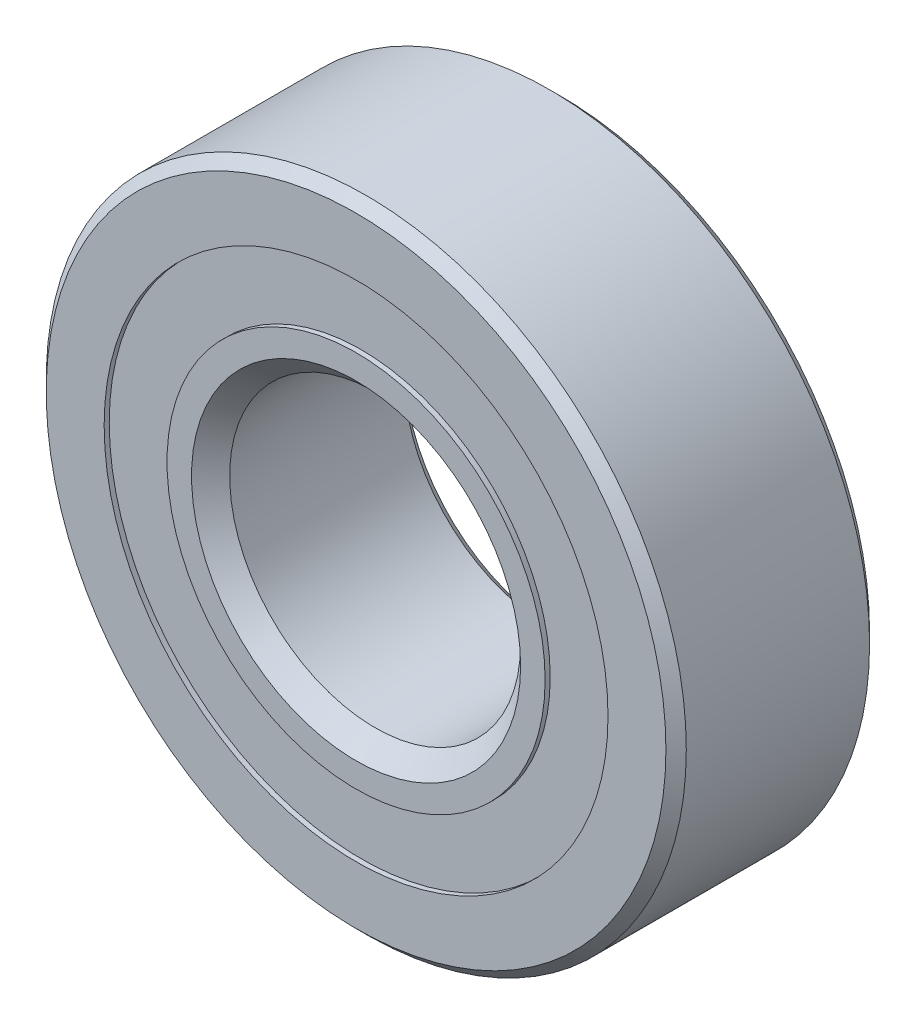
ISO-10303-21;
HEADER;
FILE_DESCRIPTION(('STEP AP214'),'2;1');
FILE_NAME('part.step','',(''),(''),'','','');
FILE_SCHEMA(('AUTOMOTIVE_DESIGN { 1 0 10303 214 1 1 1 1 }'));
ENDSEC;
DATA;
#1=APPLICATION_CONTEXT('core data for automotive mechanical design processes');
#2=APPLICATION_PROTOCOL_DEFINITION('international standard','automotive_design',2000,#1);
#3=PRODUCT_CONTEXT('',#1,'mechanical');
#4=PRODUCT('Part','Part','',(#3));
#5=PRODUCT_RELATED_PRODUCT_CATEGORY('part','',(#4));
#6=PRODUCT_DEFINITION_FORMATION('','',#4);
#7=PRODUCT_DEFINITION_CONTEXT('part definition',#1,'design');
#8=PRODUCT_DEFINITION('design','',#6,#7);
#9=PRODUCT_DEFINITION_SHAPE('','',#8);
#10=(LENGTH_UNIT() NAMED_UNIT(*) SI_UNIT(.MILLI.,.METRE.));
#11=(NAMED_UNIT(*) PLANE_ANGLE_UNIT() SI_UNIT($,.RADIAN.));
#12=(NAMED_UNIT(*) SI_UNIT($,.STERADIAN.) SOLID_ANGLE_UNIT());
#13=UNCERTAINTY_MEASURE_WITH_UNIT(LENGTH_MEASURE(1.E-05),#10,'distance_accuracy_value','');
#14=(GEOMETRIC_REPRESENTATION_CONTEXT(3) GLOBAL_UNCERTAINTY_ASSIGNED_CONTEXT((#13)) GLOBAL_UNIT_ASSIGNED_CONTEXT((#10,
#11,#12)) REPRESENTATION_CONTEXT('',''));
#15=CARTESIAN_POINT('',(0.,0.,0.));
#16=DIRECTION('',(0.,0.,1.));
#17=DIRECTION('',(1.,0.,0.));
#18=AXIS2_PLACEMENT_3D('',#15,#16,#17);
#19=CARTESIAN_POINT('',(0.,13.7467032967033,-5.2784375));
#20=DIRECTION('',(0.,0.,1.));
#21=DIRECTION('',(1.,0.,0.));
#22=AXIS2_PLACEMENT_3D('',#19,#20,#21);
#23=PLANE('',#22);
#24=CARTESIAN_POINT('',(0.,0.,-5.2784375));
#25=DIRECTION('',(0.,0.,1.));
#26=DIRECTION('',(1.,0.,0.));
#27=AXIS2_PLACEMENT_3D('',#24,#25,#26);
#28=CIRCLE('',#27,13.7467032967033);
#29=CARTESIAN_POINT('',(13.7467032967033,0.,-5.2784375));
#30=VERTEX_POINT('',#29);
#31=EDGE_CURVE('E58',#30,#30,#28,.T.);
#32=ORIENTED_EDGE('',*,*,#31,.F.);
#33=EDGE_LOOP('',(#32));
#34=FACE_BOUND('',#33,.T.);
#35=CARTESIAN_POINT('',(0.,0.,-5.2784375));
#36=DIRECTION('',(0.,0.,1.));
#37=DIRECTION('',(1.,0.,0.));
#38=AXIS2_PLACEMENT_3D('',#35,#36,#37);
#39=CIRCLE('',#38,10.3154944719791);
#40=CARTESIAN_POINT('',(10.3154944719791,0.,-5.2784375));
#41=VERTEX_POINT('',#40);
#42=EDGE_CURVE('E11',#41,#41,#39,.T.);
#43=ORIENTED_EDGE('',*,*,#42,.T.);
#44=EDGE_LOOP('',(#43));
#45=FACE_BOUND('',#44,.T.);
#46=ADVANCED_FACE('F44',(#34,#45),#23,.F.);
#47=CARTESIAN_POINT('',(0.,0.,5.55625));
#48=DIRECTION('',(0.,0.,1.));
#49=DIRECTION('',(1.,0.,0.));
#50=AXIS2_PLACEMENT_3D('',#47,#48,#49);
#51=CYLINDRICAL_SURFACE('',#50,10.3154944719791);
#52=ORIENTED_EDGE('',*,*,#42,.F.);
#53=EDGE_LOOP('',(#52));
#54=FACE_BOUND('',#53,.T.);
#55=CARTESIAN_POINT('',(0.,0.,-2.68211551867683));
#56=DIRECTION('',(0.,0.,1.));
#57=DIRECTION('',(1.,0.,0.));
#58=AXIS2_PLACEMENT_3D('',#55,#56,#57);
#59=CIRCLE('',#58,10.3154944719791);
#60=CARTESIAN_POINT('',(10.3154944719791,0.,-2.68211551867683));
#61=VERTEX_POINT('',#60);
#62=EDGE_CURVE('E50',#61,#61,#59,.T.);
#63=ORIENTED_EDGE('',*,*,#62,.T.);
#64=EDGE_LOOP('',(#63));
#65=FACE_BOUND('',#64,.T.);
#66=ADVANCED_FACE('F67',(#54,#65),#51,.F.);
#67=CARTESIAN_POINT('',(0.,13.7467032967033,-2.68211551867683));
#68=DIRECTION('',(0.,0.,-1.));
#69=DIRECTION('',(-1.,0.,0.));
#70=AXIS2_PLACEMENT_3D('',#67,#68,#69);
#71=PLANE('',#70);
#72=ORIENTED_EDGE('',*,*,#62,.F.);
#73=EDGE_LOOP('',(#72));
#74=FACE_BOUND('',#73,.T.);
#75=CARTESIAN_POINT('',(0.,0.,-2.68211551867683));
#76=DIRECTION('',(0.,0.,1.));
#77=DIRECTION('',(1.,0.,0.));
#78=AXIS2_PLACEMENT_3D('',#75,#76,#77);
#79=CIRCLE('',#78,13.7467032967033);
#80=CARTESIAN_POINT('',(13.7467032967033,0.,-2.68211551867683));
#81=VERTEX_POINT('',#80);
#82=EDGE_CURVE('E54',#81,#81,#79,.T.);
#83=ORIENTED_EDGE('',*,*,#82,.T.);
#84=EDGE_LOOP('',(#83));
#85=FACE_BOUND('',#84,.T.);
#86=ADVANCED_FACE('F71',(#74,#85),#71,.F.);
#87=CARTESIAN_POINT('',(0.,0.,5.55625));
#88=DIRECTION('',(0.,0.,1.));
#89=DIRECTION('',(1.,0.,0.));
#90=AXIS2_PLACEMENT_3D('',#87,#88,#89);
#91=CYLINDRICAL_SURFACE('',#90,13.7467032967033);
#92=ORIENTED_EDGE('',*,*,#82,.F.);
#93=EDGE_LOOP('',(#92));
#94=FACE_BOUND('',#93,.T.);
#95=ORIENTED_EDGE('',*,*,#31,.T.);
#96=EDGE_LOOP('',(#95));
#97=FACE_BOUND('',#96,.T.);
#98=ADVANCED_FACE('F64',(#94,#97),#91,.T.);
#99=CLOSED_SHELL('',(#46,#66,#86,#98));
#100=MANIFOLD_SOLID_BREP('B2',#99);
#101=CARTESIAN_POINT('',(0.,13.7467032967033,5.2784375));
#102=DIRECTION('',(0.,0.,-1.));
#103=DIRECTION('',(-1.,0.,0.));
#104=AXIS2_PLACEMENT_3D('',#101,#102,#103);
#105=PLANE('',#104);
#106=CARTESIAN_POINT('',(0.,0.,5.2784375));
#107=DIRECTION('',(0.,0.,1.));
#108=DIRECTION('',(1.,0.,0.));
#109=AXIS2_PLACEMENT_3D('',#106,#107,#108);
#110=CIRCLE('',#109,10.3154944719791);
#111=CARTESIAN_POINT('',(10.3154944719791,0.,5.2784375));
#112=VERTEX_POINT('',#111);
#113=EDGE_CURVE('E43',#112,#112,#110,.T.);
#114=ORIENTED_EDGE('',*,*,#113,.F.);
#115=EDGE_LOOP('',(#114));
#116=FACE_BOUND('',#115,.T.);
#117=CARTESIAN_POINT('',(0.,0.,5.2784375));
#118=DIRECTION('',(0.,0.,1.));
#119=DIRECTION('',(1.,0.,0.));
#120=AXIS2_PLACEMENT_3D('',#117,#118,#119);
#121=CIRCLE('',#120,13.7467032967033);
#122=CARTESIAN_POINT('',(13.7467032967033,0.,5.2784375));
#123=VERTEX_POINT('',#122);
#124=EDGE_CURVE('E126',#123,#123,#121,.T.);
#125=ORIENTED_EDGE('',*,*,#124,.T.);
#126=EDGE_LOOP('',(#125));
#127=FACE_BOUND('',#126,.T.);
#128=ADVANCED_FACE('F112',(#116,#127),#105,.F.);
#129=CARTESIAN_POINT('',(0.,0.,5.55625));
#130=DIRECTION('',(0.,0.,1.));
#131=DIRECTION('',(1.,0.,0.));
#132=AXIS2_PLACEMENT_3D('',#129,#130,#131);
#133=CYLINDRICAL_SURFACE('',#132,10.3154944719791);
#134=CARTESIAN_POINT('',(0.,0.,2.68211551867683));
#135=DIRECTION('',(0.,0.,1.));
#136=DIRECTION('',(1.,0.,0.));
#137=AXIS2_PLACEMENT_3D('',#134,#135,#136);
#138=CIRCLE('',#137,10.3154944719791);
#139=CARTESIAN_POINT('',(10.3154944719791,0.,2.68211551867683));
#140=VERTEX_POINT('',#139);
#141=EDGE_CURVE('E118',#140,#140,#138,.T.);
#142=ORIENTED_EDGE('',*,*,#141,.F.);
#143=EDGE_LOOP('',(#142));
#144=FACE_BOUND('',#143,.T.);
#145=ORIENTED_EDGE('',*,*,#113,.T.);
#146=EDGE_LOOP('',(#145));
#147=FACE_BOUND('',#146,.T.);
#148=ADVANCED_FACE('F141',(#144,#147),#133,.F.);
#149=CARTESIAN_POINT('',(0.,13.7467032967033,2.68211551867683));
#150=DIRECTION('',(0.,0.,1.));
#151=DIRECTION('',(1.,0.,0.));
#152=AXIS2_PLACEMENT_3D('',#149,#150,#151);
#153=PLANE('',#152);
#154=CARTESIAN_POINT('',(0.,0.,2.68211551867683));
#155=DIRECTION('',(0.,0.,1.));
#156=DIRECTION('',(1.,0.,0.));
#157=AXIS2_PLACEMENT_3D('',#154,#155,#156);
#158=CIRCLE('',#157,13.7467032967033);
#159=CARTESIAN_POINT('',(13.7467032967033,0.,2.68211551867683));
#160=VERTEX_POINT('',#159);
#161=EDGE_CURVE('E122',#160,#160,#158,.T.);
#162=ORIENTED_EDGE('',*,*,#161,.F.);
#163=EDGE_LOOP('',(#162));
#164=FACE_BOUND('',#163,.T.);
#165=ORIENTED_EDGE('',*,*,#141,.T.);
#166=EDGE_LOOP('',(#165));
#167=FACE_BOUND('',#166,.T.);
#168=ADVANCED_FACE('F136',(#164,#167),#153,.F.);
#169=CARTESIAN_POINT('',(0.,0.,5.55625));
#170=DIRECTION('',(0.,0.,1.));
#171=DIRECTION('',(1.,0.,0.));
#172=AXIS2_PLACEMENT_3D('',#169,#170,#171);
#173=CYLINDRICAL_SURFACE('',#172,13.7467032967033);
#174=ORIENTED_EDGE('',*,*,#124,.F.);
#175=EDGE_LOOP('',(#174));
#176=FACE_BOUND('',#175,.T.);
#177=ORIENTED_EDGE('',*,*,#161,.T.);
#178=EDGE_LOOP('',(#177));
#179=FACE_BOUND('',#178,.T.);
#180=ADVANCED_FACE('F133',(#176,#179),#173,.T.);
#181=CLOSED_SHELL('',(#128,#148,#168,#180));
#182=MANIFOLD_SOLID_BREP('B6',#181);
#183=CARTESIAN_POINT('',(-6.34999999999986,10.9985226280625,0.));
#184=DIRECTION('',(0.,0.,1.));
#185=DIRECTION('',(-0.499999999999989,0.866025403784445,0.));
#186=AXIS2_PLACEMENT_3D('',#183,#184,#185);
#187=SPHERICAL_SURFACE('',#186,2.68211551867683);
#188=CARTESIAN_POINT('',(-6.34999999999986,10.9985226280625,2.68211551867683));
#189=VERTEX_POINT('',#188);
#190=VERTEX_LOOP('',#189);
#191=FACE_BOUND('',#190,.T.);
#192=ADVANCED_FACE('F194',(#191),#187,.T.);
#193=CLOSED_SHELL('',(#192));
#194=MANIFOLD_SOLID_BREP('B38',#193);
#195=CARTESIAN_POINT('',(-10.9985226280623,6.35000000000013,0.));
#196=DIRECTION('',(0.,0.,1.));
#197=DIRECTION('',(-0.866025403784433,0.50000000000001,0.));
#198=AXIS2_PLACEMENT_3D('',#195,#196,#197);
#199=SPHERICAL_SURFACE('',#198,2.68211551867683);
#200=CARTESIAN_POINT('',(-10.9985226280623,6.35000000000013,2.68211551867683));
#201=VERTEX_POINT('',#200);
#202=VERTEX_LOOP('',#201);
#203=FACE_BOUND('',#202,.T.);
#204=ADVANCED_FACE('F227',(#203),#199,.T.);
#205=CLOSED_SHELL('',(#204));
#206=MANIFOLD_SOLID_BREP('B108',#205);
#207=CARTESIAN_POINT('',(-12.7,1.33025439009923E-13,0.));
#208=DIRECTION('',(0.,0.,1.));
#209=DIRECTION('',(-1.,0.,0.));
#210=AXIS2_PLACEMENT_3D('',#207,#208,#209);
#211=SPHERICAL_SURFACE('',#210,2.68211551867683);
#212=CARTESIAN_POINT('',(-12.7,1.33025439009923E-13,2.68211551867683));
#213=VERTEX_POINT('',#212);
#214=VERTEX_LOOP('',#213);
#215=FACE_BOUND('',#214,.T.);
#216=ADVANCED_FACE('F260',(#215),#211,.T.);
#217=CLOSED_SHELL('',(#216));
#218=MANIFOLD_SOLID_BREP('B190',#217);
#219=CARTESIAN_POINT('',(-10.9985226280624,-6.3499999999999,0.));
#220=DIRECTION('',(0.,0.,1.));
#221=DIRECTION('',(-0.866025403784443,-0.499999999999992,0.));
#222=AXIS2_PLACEMENT_3D('',#219,#220,#221);
#223=SPHERICAL_SURFACE('',#222,2.68211551867683);
#224=CARTESIAN_POINT('',(-10.9985226280624,-6.3499999999999,2.68211551867683));
#225=VERTEX_POINT('',#224);
#226=VERTEX_LOOP('',#225);
#227=FACE_BOUND('',#226,.T.);
#228=ADVANCED_FACE('F293',(#227),#223,.T.);
#229=CLOSED_SHELL('',(#228));
#230=MANIFOLD_SOLID_BREP('B223',#229);
#231=CARTESIAN_POINT('',(-6.35000000000009,-10.9985226280623,0.));
#232=DIRECTION('',(0.,0.,1.));
#233=DIRECTION('',(-0.500000000000007,-0.866025403784435,0.));
#234=AXIS2_PLACEMENT_3D('',#231,#232,#233);
#235=SPHERICAL_SURFACE('',#234,2.68211551867683);
#236=CARTESIAN_POINT('',(-6.35000000000009,-10.9985226280623,2.68211551867683));
#237=VERTEX_POINT('',#236);
#238=VERTEX_LOOP('',#237);
#239=FACE_BOUND('',#238,.T.);
#240=ADVANCED_FACE('F326',(#239),#235,.T.);
#241=CLOSED_SHELL('',(#240));
#242=MANIFOLD_SOLID_BREP('B256',#241);
#243=CARTESIAN_POINT('',(0.,-12.7,0.));
#244=DIRECTION('',(0.,0.,1.));
#245=DIRECTION('',(0.,-1.,0.));
#246=AXIS2_PLACEMENT_3D('',#243,#244,#245);
#247=SPHERICAL_SURFACE('',#246,2.68211551867683);
#248=CARTESIAN_POINT('',(0.,-12.7,2.68211551867683));
#249=VERTEX_POINT('',#248);
#250=VERTEX_LOOP('',#249);
#251=FACE_BOUND('',#250,.T.);
#252=ADVANCED_FACE('F359',(#251),#247,.T.);
#253=CLOSED_SHELL('',(#252));
#254=MANIFOLD_SOLID_BREP('B289',#253);
#255=CARTESIAN_POINT('',(6.34999999999994,-10.9985226280624,0.));
#256=DIRECTION('',(0.,0.,1.));
#257=DIRECTION('',(0.499999999999995,-0.866025403784442,0.));
#258=AXIS2_PLACEMENT_3D('',#255,#256,#257);
#259=SPHERICAL_SURFACE('',#258,2.68211551867683);
#260=CARTESIAN_POINT('',(6.34999999999994,-10.9985226280624,2.68211551867683));
#261=VERTEX_POINT('',#260);
#262=VERTEX_LOOP('',#261);
#263=FACE_BOUND('',#262,.T.);
#264=ADVANCED_FACE('F392',(#263),#259,.T.);
#265=CLOSED_SHELL('',(#264));
#266=MANIFOLD_SOLID_BREP('B322',#265);
#267=CARTESIAN_POINT('',(10.9985226280623,-6.35000000000005,0.));
#268=DIRECTION('',(0.,0.,1.));
#269=DIRECTION('',(0.866025403784436,-0.500000000000004,0.));
#270=AXIS2_PLACEMENT_3D('',#267,#268,#269);
#271=SPHERICAL_SURFACE('',#270,2.68211551867683);
#272=CARTESIAN_POINT('',(10.9985226280623,-6.35000000000005,2.68211551867683));
#273=VERTEX_POINT('',#272);
#274=VERTEX_LOOP('',#273);
#275=FACE_BOUND('',#274,.T.);
#276=ADVANCED_FACE('F425',(#275),#271,.T.);
#277=CLOSED_SHELL('',(#276));
#278=MANIFOLD_SOLID_BREP('B355',#277);
#279=CARTESIAN_POINT('',(12.7,0.,0.));
#280=DIRECTION('',(0.,0.,1.));
#281=DIRECTION('',(1.,0.,0.));
#282=AXIS2_PLACEMENT_3D('',#279,#280,#281);
#283=SPHERICAL_SURFACE('',#282,2.68211551867683);
#284=CARTESIAN_POINT('',(12.7,0.,2.68211551867683));
#285=VERTEX_POINT('',#284);
#286=VERTEX_LOOP('',#285);
#287=FACE_BOUND('',#286,.T.);
#288=ADVANCED_FACE('F458',(#287),#283,.T.);
#289=CLOSED_SHELL('',(#288));
#290=MANIFOLD_SOLID_BREP('B388',#289);
#291=CARTESIAN_POINT('',(10.9985226280624,6.34999999999997,0.));
#292=DIRECTION('',(0.,0.,1.));
#293=DIRECTION('',(0.86602540378444,0.499999999999998,0.));
#294=AXIS2_PLACEMENT_3D('',#291,#292,#293);
#295=SPHERICAL_SURFACE('',#294,2.68211551867683);
#296=CARTESIAN_POINT('',(10.9985226280624,6.34999999999997,2.68211551867683));
#297=VERTEX_POINT('',#296);
#298=VERTEX_LOOP('',#297);
#299=FACE_BOUND('',#298,.T.);
#300=ADVANCED_FACE('F491',(#299),#295,.T.);
#301=CLOSED_SHELL('',(#300));
#302=MANIFOLD_SOLID_BREP('B421',#301);
#303=CARTESIAN_POINT('',(6.35000000000001,10.9985226280624,0.));
#304=DIRECTION('',(0.,0.,1.));
#305=DIRECTION('',(0.500000000000001,0.866025403784438,0.));
#306=AXIS2_PLACEMENT_3D('',#303,#304,#305);
#307=SPHERICAL_SURFACE('',#306,2.68211551867683);
#308=CARTESIAN_POINT('',(6.35000000000001,10.9985226280624,2.68211551867683));
#309=VERTEX_POINT('',#308);
#310=VERTEX_LOOP('',#309);
#311=FACE_BOUND('',#310,.T.);
#312=ADVANCED_FACE('F524',(#311),#307,.T.);
#313=CLOSED_SHELL('',(#312));
#314=MANIFOLD_SOLID_BREP('B454',#313);
#315=CARTESIAN_POINT('',(0.,12.7,0.));
#316=DIRECTION('',(0.,0.,1.));
#317=DIRECTION('',(0.,1.,0.));
#318=AXIS2_PLACEMENT_3D('',#315,#316,#317);
#319=SPHERICAL_SURFACE('',#318,2.68211551867683);
#320=CARTESIAN_POINT('',(0.,12.7,2.68211551867683));
#321=VERTEX_POINT('',#320);
#322=VERTEX_LOOP('',#321);
#323=FACE_BOUND('',#322,.T.);
#324=ADVANCED_FACE('F559',(#323),#319,.T.);
#325=CLOSED_SHELL('',(#324));
#326=MANIFOLD_SOLID_BREP('B487',#325);
#327=CARTESIAN_POINT('',(0.,0.,5.55625));
#328=DIRECTION('',(0.,0.,1.));
#329=DIRECTION('',(1.,0.,0.));
#330=AXIS2_PLACEMENT_3D('',#327,#328,#329);
#331=CYLINDRICAL_SURFACE('',#330,10.3154944719791);
#332=CARTESIAN_POINT('',(0.,0.,5.55625));
#333=DIRECTION('',(0.,0.,1.));
#334=DIRECTION('',(1.,0.,0.));
#335=AXIS2_PLACEMENT_3D('',#332,#333,#334);
#336=CIRCLE('',#335,10.3154944719791);
#337=CARTESIAN_POINT('',(10.3154944719791,0.,5.55625));
#338=VERTEX_POINT('',#337);
#339=EDGE_CURVE('E619',#338,#338,#336,.T.);
#340=ORIENTED_EDGE('',*,*,#339,.F.);
#341=EDGE_LOOP('',(#340));
#342=FACE_BOUND('',#341,.T.);
#343=CARTESIAN_POINT('',(0.,0.,5.2784375));
#344=DIRECTION('',(0.,0.,1.));
#345=DIRECTION('',(1.,0.,0.));
#346=AXIS2_PLACEMENT_3D('',#343,#344,#345);
#347=CIRCLE('',#346,10.3154944719791);
#348=CARTESIAN_POINT('',(10.3154944719791,0.,5.2784375));
#349=VERTEX_POINT('',#348);
#350=EDGE_CURVE('E558',#349,#349,#347,.T.);
#351=ORIENTED_EDGE('',*,*,#350,.T.);
#352=EDGE_LOOP('',(#351));
#353=FACE_BOUND('',#352,.T.);
#354=ADVANCED_FACE('F579',(#342,#353),#331,.T.);
#355=CARTESIAN_POINT('',(0.,10.3154944719791,5.2784375));
#356=DIRECTION('',(0.,0.,1.));
#357=DIRECTION('',(1.,0.,0.));
#358=AXIS2_PLACEMENT_3D('',#355,#356,#357);
#359=PLANE('',#358);
#360=ORIENTED_EDGE('',*,*,#350,.F.);
#361=EDGE_LOOP('',(#360));
#362=FACE_BOUND('',#361,.T.);
#363=CARTESIAN_POINT('',(0.,0.,5.2784375));
#364=DIRECTION('',(0.,0.,1.));
#365=DIRECTION('',(1.,0.,0.));
#366=AXIS2_PLACEMENT_3D('',#363,#364,#365);
#367=CIRCLE('',#366,10.0376819719791);
#368=CARTESIAN_POINT('',(10.0376819719791,0.,5.2784375));
#369=VERTEX_POINT('',#368);
#370=EDGE_CURVE('E585',#369,#369,#367,.T.);
#371=ORIENTED_EDGE('',*,*,#370,.T.);
#372=EDGE_LOOP('',(#371));
#373=FACE_BOUND('',#372,.T.);
#374=ADVANCED_FACE('F626',(#362,#373),#359,.F.);
#375=CARTESIAN_POINT('',(0.,0.,4.21844776868245));
#376=DIRECTION('',(0.,0.,1.));
#377=DIRECTION('',(1.,0.,0.));
#378=AXIS2_PLACEMENT_3D('',#375,#376,#377);
#379=CONICAL_SURFACE('',#378,8.97769224066158,0.78539816339745);
#380=ORIENTED_EDGE('',*,*,#370,.F.);
#381=EDGE_LOOP('',(#380));
#382=FACE_BOUND('',#381,.T.);
#383=CARTESIAN_POINT('',(0.,0.,4.21844776868245));
#384=DIRECTION('',(0.,0.,1.));
#385=DIRECTION('',(1.,0.,0.));
#386=AXIS2_PLACEMENT_3D('',#383,#384,#385);
#387=CIRCLE('',#386,8.97769224066158);
#388=CARTESIAN_POINT('',(8.97769224066158,0.,4.21844776868245));
#389=VERTEX_POINT('',#388);
#390=EDGE_CURVE('E589',#389,#389,#387,.T.);
#391=ORIENTED_EDGE('',*,*,#390,.T.);
#392=EDGE_LOOP('',(#391));
#393=FACE_BOUND('',#392,.T.);
#394=ADVANCED_FACE('F630',(#382,#393),#379,.T.);
#395=CARTESIAN_POINT('',(0.,0.,5.55625));
#396=DIRECTION('',(0.,0.,1.));
#397=DIRECTION('',(1.,0.,0.));
#398=AXIS2_PLACEMENT_3D('',#395,#396,#397);
#399=CYLINDRICAL_SURFACE('',#398,8.97769224066159);
#400=ORIENTED_EDGE('',*,*,#390,.F.);
#401=EDGE_LOOP('',(#400));
#402=FACE_BOUND('',#401,.T.);
#403=CARTESIAN_POINT('',(0.,0.,0.));
#404=DIRECTION('',(0.,0.,1.));
#405=DIRECTION('',(1.,0.,0.));
#406=AXIS2_PLACEMENT_3D('',#403,#404,#405);
#407=CIRCLE('',#406,8.97769224066159);
#408=CARTESIAN_POINT('',(8.97769224066159,0.,0.));
#409=VERTEX_POINT('',#408);
#410=EDGE_CURVE('E593',#409,#409,#407,.T.);
#411=ORIENTED_EDGE('',*,*,#410,.T.);
#412=EDGE_LOOP('',(#411));
#413=FACE_BOUND('',#412,.T.);
#414=ADVANCED_FACE('F635',(#402,#413),#399,.T.);
#415=CARTESIAN_POINT('',(0.,8.97769224066159,0.));
#416=DIRECTION('',(0.,0.,-1.));
#417=DIRECTION('',(-1.,0.,0.));
#418=AXIS2_PLACEMENT_3D('',#415,#416,#417);
#419=PLANE('',#418);
#420=ORIENTED_EDGE('',*,*,#410,.F.);
#421=EDGE_LOOP('',(#420));
#422=FACE_BOUND('',#421,.T.);
#423=CARTESIAN_POINT('',(0.,0.,0.));
#424=DIRECTION('',(0.,0.,1.));
#425=DIRECTION('',(1.,0.,0.));
#426=AXIS2_PLACEMENT_3D('',#423,#424,#425);
#427=CIRCLE('',#426,10.0178844813232);
#428=CARTESIAN_POINT('',(10.0178844813232,0.,0.));
#429=VERTEX_POINT('',#428);
#430=EDGE_CURVE('E598',#429,#429,#427,.T.);
#431=ORIENTED_EDGE('',*,*,#430,.T.);
#432=EDGE_LOOP('',(#431));
#433=FACE_BOUND('',#432,.T.);
#434=ADVANCED_FACE('F641',(#422,#433),#419,.F.);
#435=CARTESIAN_POINT('',(0.,0.,0.));
#436=DIRECTION('',(0.,0.,1.));
#437=DIRECTION('',(1.,0.,0.));
#438=AXIS2_PLACEMENT_3D('',#435,#436,#437);
#439=TOROIDAL_SURFACE('',#438,12.7,2.68211551867683);
#440=ORIENTED_EDGE('',*,*,#430,.F.);
#441=EDGE_LOOP('',(#440));
#442=FACE_BOUND('',#441,.T.);
#443=CARTESIAN_POINT('',(0.,0.,-2.46944444444444));
#444=DIRECTION('',(0.,0.,1.));
#445=DIRECTION('',(1.,0.,0.));
#446=AXIS2_PLACEMENT_3D('',#443,#444,#445);
#447=CIRCLE('',#446,11.6532967032967);
#448=CARTESIAN_POINT('',(11.6532967032967,0.,-2.46944444444444));
#449=VERTEX_POINT('',#448);
#450=EDGE_CURVE('E601',#449,#449,#447,.T.);
#451=ORIENTED_EDGE('',*,*,#450,.T.);
#452=EDGE_LOOP('',(#451));
#453=FACE_BOUND('',#452,.T.);
#454=ADVANCED_FACE('F645',(#442,#453),#439,.F.);
#455=CARTESIAN_POINT('',(0.,0.,5.55625));
#456=DIRECTION('',(0.,0.,1.));
#457=DIRECTION('',(1.,0.,0.));
#458=AXIS2_PLACEMENT_3D('',#455,#456,#457);
#459=CYLINDRICAL_SURFACE('',#458,11.6532967032967);
#460=ORIENTED_EDGE('',*,*,#450,.F.);
#461=EDGE_LOOP('',(#460));
#462=FACE_BOUND('',#461,.T.);
#463=CARTESIAN_POINT('',(0.,0.,-5.55625));
#464=DIRECTION('',(0.,0.,1.));
#465=DIRECTION('',(1.,0.,0.));
#466=AXIS2_PLACEMENT_3D('',#463,#464,#465);
#467=CIRCLE('',#466,11.6532967032967);
#468=CARTESIAN_POINT('',(11.6532967032967,0.,-5.55625));
#469=VERTEX_POINT('',#468);
#470=EDGE_CURVE('E604',#469,#469,#467,.T.);
#471=ORIENTED_EDGE('',*,*,#470,.T.);
#472=EDGE_LOOP('',(#471));
#473=FACE_BOUND('',#472,.T.);
#474=ADVANCED_FACE('F649',(#462,#473),#459,.T.);
#475=CARTESIAN_POINT('',(0.,8.493125,-5.55625));
#476=DIRECTION('',(0.,0.,1.));
#477=DIRECTION('',(1.,0.,0.));
#478=AXIS2_PLACEMENT_3D('',#475,#476,#477);
#479=PLANE('',#478);
#480=ORIENTED_EDGE('',*,*,#470,.F.);
#481=EDGE_LOOP('',(#480));
#482=FACE_BOUND('',#481,.T.);
#483=CARTESIAN_POINT('',(0.,0.,-5.55625));
#484=DIRECTION('',(0.,0.,1.));
#485=DIRECTION('',(1.,0.,0.));
#486=AXIS2_PLACEMENT_3D('',#483,#484,#485);
#487=CIRCLE('',#486,8.493125);
#488=CARTESIAN_POINT('',(8.493125,0.,-5.55625));
#489=VERTEX_POINT('',#488);
#490=EDGE_CURVE('E607',#489,#489,#487,.T.);
#491=ORIENTED_EDGE('',*,*,#490,.T.);
#492=EDGE_LOOP('',(#491));
#493=FACE_BOUND('',#492,.T.);
#494=ADVANCED_FACE('F653',(#482,#493),#479,.F.);
#495=CARTESIAN_POINT('',(0.,0.,-5.000625));
#496=DIRECTION('',(0.,0.,-1.));
#497=DIRECTION('',(-1.,0.,0.));
#498=AXIS2_PLACEMENT_3D('',#495,#496,#497);
#499=CONICAL_SURFACE('',#498,7.9375,0.785398163397445);
#500=ORIENTED_EDGE('',*,*,#490,.F.);
#501=EDGE_LOOP('',(#500));
#502=FACE_BOUND('',#501,.T.);
#503=CARTESIAN_POINT('',(0.,0.,-5.000625));
#504=DIRECTION('',(0.,0.,1.));
#505=DIRECTION('',(1.,0.,0.));
#506=AXIS2_PLACEMENT_3D('',#503,#504,#505);
#507=CIRCLE('',#506,7.9375);
#508=CARTESIAN_POINT('',(7.9375,0.,-5.000625));
#509=VERTEX_POINT('',#508);
#510=EDGE_CURVE('E610',#509,#509,#507,.T.);
#511=ORIENTED_EDGE('',*,*,#510,.T.);
#512=EDGE_LOOP('',(#511));
#513=FACE_BOUND('',#512,.T.);
#514=ADVANCED_FACE('F657',(#502,#513),#499,.F.);
#515=CARTESIAN_POINT('',(0.,0.,5.55625));
#516=DIRECTION('',(0.,0.,1.));
#517=DIRECTION('',(1.,0.,0.));
#518=AXIS2_PLACEMENT_3D('',#515,#516,#517);
#519=CYLINDRICAL_SURFACE('',#518,7.9375);
#520=ORIENTED_EDGE('',*,*,#510,.F.);
#521=EDGE_LOOP('',(#520));
#522=FACE_BOUND('',#521,.T.);
#523=CARTESIAN_POINT('',(0.,0.,4.51605775933842));
#524=DIRECTION('',(0.,0.,1.));
#525=DIRECTION('',(1.,0.,0.));
#526=AXIS2_PLACEMENT_3D('',#523,#524,#525);
#527=CIRCLE('',#526,7.9375);
#528=CARTESIAN_POINT('',(7.9375,0.,4.51605775933842));
#529=VERTEX_POINT('',#528);
#530=EDGE_CURVE('E613',#529,#529,#527,.T.);
#531=ORIENTED_EDGE('',*,*,#530,.T.);
#532=EDGE_LOOP('',(#531));
#533=FACE_BOUND('',#532,.T.);
#534=ADVANCED_FACE('F661',(#522,#533),#519,.F.);
#535=CARTESIAN_POINT('',(0.,0.,5.55625));
#536=DIRECTION('',(0.,0.,1.));
#537=DIRECTION('',(1.,0.,0.));
#538=AXIS2_PLACEMENT_3D('',#535,#536,#537);
#539=CONICAL_SURFACE('',#538,8.97769224066158,0.78539816339745);
#540=ORIENTED_EDGE('',*,*,#530,.F.);
#541=EDGE_LOOP('',(#540));
#542=FACE_BOUND('',#541,.T.);
#543=CARTESIAN_POINT('',(0.,0.,5.55625));
#544=DIRECTION('',(0.,0.,1.));
#545=DIRECTION('',(1.,0.,0.));
#546=AXIS2_PLACEMENT_3D('',#543,#544,#545);
#547=CIRCLE('',#546,8.97769224066158);
#548=CARTESIAN_POINT('',(8.97769224066158,0.,5.55625));
#549=VERTEX_POINT('',#548);
#550=EDGE_CURVE('E616',#549,#549,#547,.T.);
#551=ORIENTED_EDGE('',*,*,#550,.T.);
#552=EDGE_LOOP('',(#551));
#553=FACE_BOUND('',#552,.T.);
#554=ADVANCED_FACE('F665',(#542,#553),#539,.F.);
#555=CARTESIAN_POINT('',(0.,10.3154944719791,5.55625));
#556=DIRECTION('',(0.,0.,-1.));
#557=DIRECTION('',(-1.,0.,0.));
#558=AXIS2_PLACEMENT_3D('',#555,#556,#557);
#559=PLANE('',#558);
#560=ORIENTED_EDGE('',*,*,#550,.F.);
#561=EDGE_LOOP('',(#560));
#562=FACE_BOUND('',#561,.T.);
#563=ORIENTED_EDGE('',*,*,#339,.T.);
#564=EDGE_LOOP('',(#563));
#565=FACE_BOUND('',#564,.T.);
#566=ADVANCED_FACE('F623',(#562,#565),#559,.F.);
#567=CLOSED_SHELL('',(#354,#374,#394,#414,#434,#454,#474,#494,#514,#534,#554,#566));
#568=MANIFOLD_SOLID_BREP('B520',#567);
#569=CARTESIAN_POINT('',(0.,0.,5.000625));
#570=DIRECTION('',(0.,0.,-1.));
#571=DIRECTION('',(-1.,0.,0.));
#572=AXIS2_PLACEMENT_3D('',#569,#570,#571);
#573=CONICAL_SURFACE('',#572,17.4625,0.785398163397447);
#574=CARTESIAN_POINT('',(0.,0.,5.55625));
#575=DIRECTION('',(0.,0.,1.));
#576=DIRECTION('',(1.,0.,0.));
#577=AXIS2_PLACEMENT_3D('',#574,#575,#576);
#578=CIRCLE('',#577,16.906875);
#579=CARTESIAN_POINT('',(16.906875,0.,5.55625));
#580=VERTEX_POINT('',#579);
#581=EDGE_CURVE('E789',#580,#580,#578,.T.);
#582=ORIENTED_EDGE('',*,*,#581,.F.);
#583=EDGE_LOOP('',(#582));
#584=FACE_BOUND('',#583,.T.);
#585=CARTESIAN_POINT('',(0.,0.,5.000625));
#586=DIRECTION('',(0.,0.,1.));
#587=DIRECTION('',(1.,0.,0.));
#588=AXIS2_PLACEMENT_3D('',#585,#586,#587);
#589=CIRCLE('',#588,17.4625);
#590=CARTESIAN_POINT('',(17.4625,0.,5.000625));
#591=VERTEX_POINT('',#590);
#592=EDGE_CURVE('E578',#591,#591,#589,.T.);
#593=ORIENTED_EDGE('',*,*,#592,.T.);
#594=EDGE_LOOP('',(#593));
#595=FACE_BOUND('',#594,.T.);
#596=ADVANCED_FACE('F761',(#584,#595),#573,.T.);
#597=CARTESIAN_POINT('',(0.,0.,5.55625));
#598=DIRECTION('',(0.,0.,1.));
#599=DIRECTION('',(1.,0.,0.));
#600=AXIS2_PLACEMENT_3D('',#597,#598,#599);
#601=CYLINDRICAL_SURFACE('',#600,17.4625);
#602=ORIENTED_EDGE('',*,*,#592,.F.);
#603=EDGE_LOOP('',(#602));
#604=FACE_BOUND('',#603,.T.);
#605=CARTESIAN_POINT('',(0.,0.,-5.000625));
#606=DIRECTION('',(0.,0.,1.));
#607=DIRECTION('',(1.,0.,0.));
#608=AXIS2_PLACEMENT_3D('',#605,#606,#607);
#609=CIRCLE('',#608,17.4625);
#610=CARTESIAN_POINT('',(17.4625,0.,-5.000625));
#611=VERTEX_POINT('',#610);
#612=EDGE_CURVE('E767',#611,#611,#609,.T.);
#613=ORIENTED_EDGE('',*,*,#612,.T.);
#614=EDGE_LOOP('',(#613));
#615=FACE_BOUND('',#614,.T.);
#616=ADVANCED_FACE('F796',(#604,#615),#601,.T.);
#617=CARTESIAN_POINT('',(0.,0.,-5.55625));
#618=DIRECTION('',(0.,0.,1.));
#619=DIRECTION('',(1.,0.,0.));
#620=AXIS2_PLACEMENT_3D('',#617,#618,#619);
#621=CONICAL_SURFACE('',#620,16.906875,0.785398163397448);
#622=ORIENTED_EDGE('',*,*,#612,.F.);
#623=EDGE_LOOP('',(#622));
#624=FACE_BOUND('',#623,.T.);
#625=CARTESIAN_POINT('',(0.,0.,-5.55625));
#626=DIRECTION('',(0.,0.,1.));
#627=DIRECTION('',(1.,0.,0.));
#628=AXIS2_PLACEMENT_3D('',#625,#626,#627);
#629=CIRCLE('',#628,16.906875);
#630=CARTESIAN_POINT('',(16.906875,0.,-5.55625));
#631=VERTEX_POINT('',#630);
#632=EDGE_CURVE('E771',#631,#631,#629,.T.);
#633=ORIENTED_EDGE('',*,*,#632,.T.);
#634=EDGE_LOOP('',(#633));
#635=FACE_BOUND('',#634,.T.);
#636=ADVANCED_FACE('F800',(#624,#635),#621,.T.);
#637=CARTESIAN_POINT('',(0.,16.906875,-5.55625));
#638=DIRECTION('',(0.,0.,1.));
#639=DIRECTION('',(1.,0.,0.));
#640=AXIS2_PLACEMENT_3D('',#637,#638,#639);
#641=PLANE('',#640);
#642=ORIENTED_EDGE('',*,*,#632,.F.);
#643=EDGE_LOOP('',(#642));
#644=FACE_BOUND('',#643,.T.);
#645=CARTESIAN_POINT('',(0.,0.,-5.55625));
#646=DIRECTION('',(0.,0.,1.));
#647=DIRECTION('',(1.,0.,0.));
#648=AXIS2_PLACEMENT_3D('',#645,#646,#647);
#649=CIRCLE('',#648,13.7467032967033);
#650=CARTESIAN_POINT('',(13.7467032967033,0.,-5.55625));
#651=VERTEX_POINT('',#650);
#652=EDGE_CURVE('E775',#651,#651,#649,.T.);
#653=ORIENTED_EDGE('',*,*,#652,.T.);
#654=EDGE_LOOP('',(#653));
#655=FACE_BOUND('',#654,.T.);
#656=ADVANCED_FACE('F805',(#644,#655),#641,.F.);
#657=CARTESIAN_POINT('',(0.,0.,5.55625));
#658=DIRECTION('',(0.,0.,1.));
#659=DIRECTION('',(1.,0.,0.));
#660=AXIS2_PLACEMENT_3D('',#657,#658,#659);
#661=CYLINDRICAL_SURFACE('',#660,13.7467032967033);
#662=ORIENTED_EDGE('',*,*,#652,.F.);
#663=EDGE_LOOP('',(#662));
#664=FACE_BOUND('',#663,.T.);
#665=CARTESIAN_POINT('',(0.,0.,-2.46944444444444));
#666=DIRECTION('',(0.,0.,1.));
#667=DIRECTION('',(1.,0.,0.));
#668=AXIS2_PLACEMENT_3D('',#665,#666,#667);
#669=CIRCLE('',#668,13.7467032967033);
#670=CARTESIAN_POINT('',(13.7467032967033,0.,-2.46944444444444));
#671=VERTEX_POINT('',#670);
#672=EDGE_CURVE('E780',#671,#671,#669,.T.);
#673=ORIENTED_EDGE('',*,*,#672,.T.);
#674=EDGE_LOOP('',(#673));
#675=FACE_BOUND('',#674,.T.);
#676=ADVANCED_FACE('F811',(#664,#675),#661,.F.);
#677=CARTESIAN_POINT('',(0.,0.,0.));
#678=DIRECTION('',(0.,0.,1.));
#679=DIRECTION('',(1.,0.,0.));
#680=AXIS2_PLACEMENT_3D('',#677,#678,#679);
#681=TOROIDAL_SURFACE('',#680,12.7,2.68211551867683);
#682=ORIENTED_EDGE('',*,*,#672,.F.);
#683=EDGE_LOOP('',(#682));
#684=FACE_BOUND('',#683,.T.);
#685=CARTESIAN_POINT('',(0.,0.,2.46944444444444));
#686=DIRECTION('',(0.,0.,1.));
#687=DIRECTION('',(1.,0.,0.));
#688=AXIS2_PLACEMENT_3D('',#685,#686,#687);
#689=CIRCLE('',#688,13.7467032967033);
#690=CARTESIAN_POINT('',(13.7467032967033,0.,2.46944444444444));
#691=VERTEX_POINT('',#690);
#692=EDGE_CURVE('E783',#691,#691,#689,.T.);
#693=ORIENTED_EDGE('',*,*,#692,.T.);
#694=EDGE_LOOP('',(#693));
#695=FACE_BOUND('',#694,.T.);
#696=ADVANCED_FACE('F815',(#684,#695),#681,.F.);
#697=CARTESIAN_POINT('',(0.,0.,5.55625));
#698=DIRECTION('',(0.,0.,1.));
#699=DIRECTION('',(1.,0.,0.));
#700=AXIS2_PLACEMENT_3D('',#697,#698,#699);
#701=CYLINDRICAL_SURFACE('',#700,13.7467032967033);
#702=ORIENTED_EDGE('',*,*,#692,.F.);
#703=EDGE_LOOP('',(#702));
#704=FACE_BOUND('',#703,.T.);
#705=CARTESIAN_POINT('',(0.,0.,5.55625));
#706=DIRECTION('',(0.,0.,1.));
#707=DIRECTION('',(1.,0.,0.));
#708=AXIS2_PLACEMENT_3D('',#705,#706,#707);
#709=CIRCLE('',#708,13.7467032967033);
#710=CARTESIAN_POINT('',(13.7467032967033,0.,5.55625));
#711=VERTEX_POINT('',#710);
#712=EDGE_CURVE('E786',#711,#711,#709,.T.);
#713=ORIENTED_EDGE('',*,*,#712,.T.);
#714=EDGE_LOOP('',(#713));
#715=FACE_BOUND('',#714,.T.);
#716=ADVANCED_FACE('F819',(#704,#715),#701,.F.);
#717=CARTESIAN_POINT('',(0.,16.906875,5.55625));
#718=DIRECTION('',(0.,0.,-1.));
#719=DIRECTION('',(-1.,0.,0.));
#720=AXIS2_PLACEMENT_3D('',#717,#718,#719);
#721=PLANE('',#720);
#722=ORIENTED_EDGE('',*,*,#712,.F.);
#723=EDGE_LOOP('',(#722));
#724=FACE_BOUND('',#723,.T.);
#725=ORIENTED_EDGE('',*,*,#581,.T.);
#726=EDGE_LOOP('',(#725));
#727=FACE_BOUND('',#726,.T.);
#728=ADVANCED_FACE('F793',(#724,#727),#721,.F.);
#729=CLOSED_SHELL('',(#596,#616,#636,#656,#676,#696,#716,#728));
#730=MANIFOLD_SOLID_BREP('B553',#729);
#731=ADVANCED_BREP_SHAPE_REPRESENTATION('',(#18,#100,#182,#194,#206,#218,#230,#242,#254,#266,
#278,#290,#302,#314,#326,#568,#730),#14);
#732=SHAPE_DEFINITION_REPRESENTATION(#9,#731);
ENDSEC;
END-ISO-10303-21;
